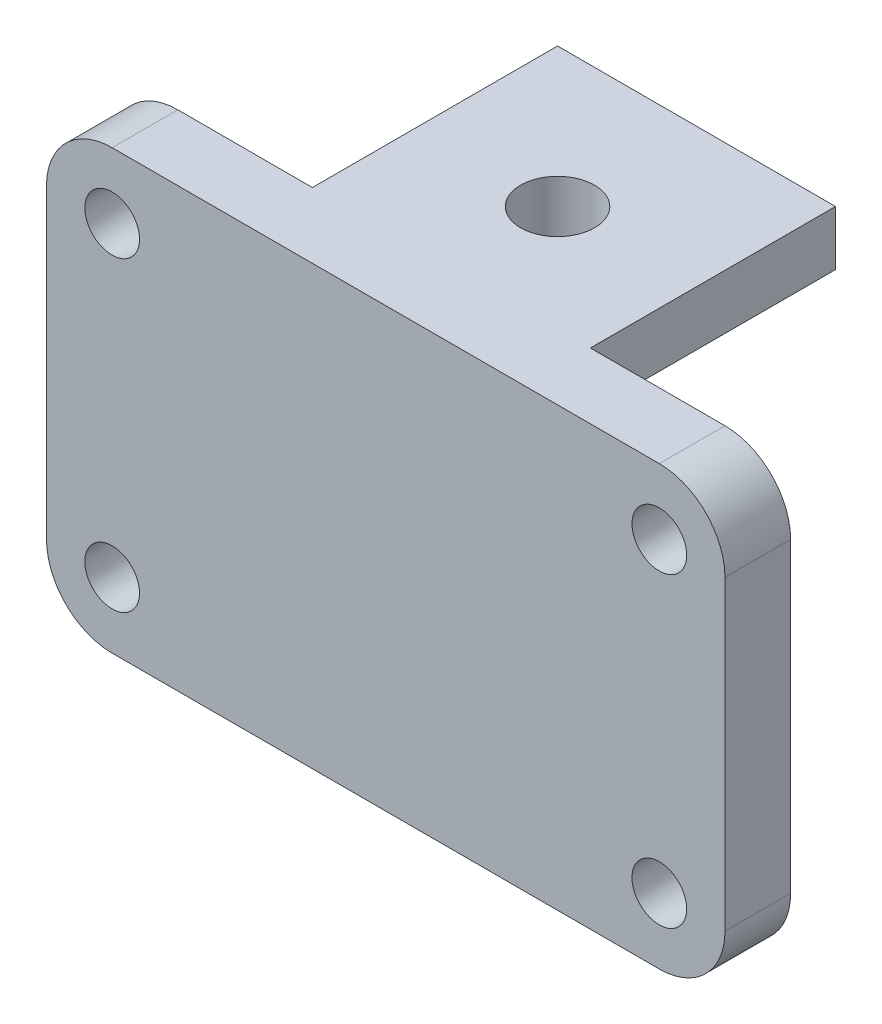
ISO-10303-21;
HEADER;
FILE_DESCRIPTION(('STEP AP214'),'2;1');
FILE_NAME('part.step','',(''),(''),'','','');
FILE_SCHEMA(('AUTOMOTIVE_DESIGN { 1 0 10303 214 1 1 1 1 }'));
ENDSEC;
DATA;
#1=APPLICATION_CONTEXT('core data for automotive mechanical design processes');
#2=APPLICATION_PROTOCOL_DEFINITION('international standard','automotive_design',2000,#1);
#3=PRODUCT_CONTEXT('',#1,'mechanical');
#4=PRODUCT('Part','Part','',(#3));
#5=PRODUCT_RELATED_PRODUCT_CATEGORY('part','',(#4));
#6=PRODUCT_DEFINITION_FORMATION('','',#4);
#7=PRODUCT_DEFINITION_CONTEXT('part definition',#1,'design');
#8=PRODUCT_DEFINITION('design','',#6,#7);
#9=PRODUCT_DEFINITION_SHAPE('','',#8);
#10=(LENGTH_UNIT() NAMED_UNIT(*) SI_UNIT(.MILLI.,.METRE.));
#11=(NAMED_UNIT(*) PLANE_ANGLE_UNIT() SI_UNIT($,.RADIAN.));
#12=(NAMED_UNIT(*) SI_UNIT($,.STERADIAN.) SOLID_ANGLE_UNIT());
#13=UNCERTAINTY_MEASURE_WITH_UNIT(LENGTH_MEASURE(1.E-05),#10,'distance_accuracy_value','');
#14=(GEOMETRIC_REPRESENTATION_CONTEXT(3) GLOBAL_UNCERTAINTY_ASSIGNED_CONTEXT((#13)) GLOBAL_UNIT_ASSIGNED_CONTEXT((#10,
#11,#12)) REPRESENTATION_CONTEXT('',''));
#15=CARTESIAN_POINT('',(0.,0.,0.));
#16=DIRECTION('',(0.,0.,1.));
#17=DIRECTION('',(1.,0.,0.));
#18=AXIS2_PLACEMENT_3D('',#15,#16,#17);
#19=CARTESIAN_POINT('',(12.7,5.,-12.7));
#20=DIRECTION('',(-1.,0.,0.));
#21=DIRECTION('',(0.,0.,1.));
#22=AXIS2_PLACEMENT_3D('',#19,#20,#21);
#23=PLANE('',#22);
#24=DIRECTION('',(0.,1.,0.));
#25=VECTOR('',#24,1.);
#26=CARTESIAN_POINT('',(12.7,5.,9.7));
#27=LINE('',#26,#25);
#28=CARTESIAN_POINT('',(12.7,0.,9.7));
#29=VERTEX_POINT('',#28);
#30=CARTESIAN_POINT('',(12.7,5.,9.7));
#31=VERTEX_POINT('',#30);
#32=EDGE_CURVE('E152',#29,#31,#27,.T.);
#33=ORIENTED_EDGE('',*,*,#32,.F.);
#34=DIRECTION('',(0.,0.,-1.));
#35=VECTOR('',#34,1.);
#36=CARTESIAN_POINT('',(12.7,0.,-12.7));
#37=LINE('',#36,#35);
#38=CARTESIAN_POINT('',(12.7,0.,-12.7));
#39=VERTEX_POINT('',#38);
#40=EDGE_CURVE('E137',#29,#39,#37,.T.);
#41=ORIENTED_EDGE('',*,*,#40,.T.);
#42=DIRECTION('',(0.,-1.,0.));
#43=VECTOR('',#42,1.);
#44=CARTESIAN_POINT('',(12.7,5.,-12.7));
#45=LINE('',#44,#43);
#46=CARTESIAN_POINT('',(12.7,5.,-12.7));
#47=VERTEX_POINT('',#46);
#48=EDGE_CURVE('E166',#47,#39,#45,.T.);
#49=ORIENTED_EDGE('',*,*,#48,.F.);
#50=DIRECTION('',(0.,0.,-1.));
#51=VECTOR('',#50,1.);
#52=CARTESIAN_POINT('',(12.7,5.,-12.7));
#53=LINE('',#52,#51);
#54=EDGE_CURVE('E153',#31,#47,#53,.T.);
#55=ORIENTED_EDGE('',*,*,#54,.F.);
#56=EDGE_LOOP('',(#33,#41,#49,#55));
#57=FACE_BOUND('',#56,.T.);
#58=ADVANCED_FACE('F47',(#57),#23,.F.);
#59=CARTESIAN_POINT('',(-12.7,5.,-12.7));
#60=DIRECTION('',(1.,0.,0.));
#61=DIRECTION('',(0.,0.,-1.));
#62=AXIS2_PLACEMENT_3D('',#59,#60,#61);
#63=PLANE('',#62);
#64=DIRECTION('',(0.,-1.,0.));
#65=VECTOR('',#64,1.);
#66=CARTESIAN_POINT('',(-12.7,5.,9.7));
#67=LINE('',#66,#65);
#68=CARTESIAN_POINT('',(-12.7,5.,9.7));
#69=VERTEX_POINT('',#68);
#70=CARTESIAN_POINT('',(-12.7,0.,9.7));
#71=VERTEX_POINT('',#70);
#72=EDGE_CURVE('E158',#69,#71,#67,.T.);
#73=ORIENTED_EDGE('',*,*,#72,.F.);
#74=DIRECTION('',(0.,0.,1.));
#75=VECTOR('',#74,1.);
#76=CARTESIAN_POINT('',(-12.7,5.,-12.7));
#77=LINE('',#76,#75);
#78=CARTESIAN_POINT('',(-12.7,5.,-12.7));
#79=VERTEX_POINT('',#78);
#80=EDGE_CURVE('E279',#79,#69,#77,.T.);
#81=ORIENTED_EDGE('',*,*,#80,.F.);
#82=DIRECTION('',(0.,-1.,0.));
#83=VECTOR('',#82,1.);
#84=CARTESIAN_POINT('',(-12.7,5.,-12.7));
#85=LINE('',#84,#83);
#86=CARTESIAN_POINT('',(-12.7,0.,-12.7));
#87=VERTEX_POINT('',#86);
#88=EDGE_CURVE('E172',#79,#87,#85,.T.);
#89=ORIENTED_EDGE('',*,*,#88,.T.);
#90=DIRECTION('',(0.,0.,1.));
#91=VECTOR('',#90,1.);
#92=CARTESIAN_POINT('',(-12.7,0.,-12.7));
#93=LINE('',#92,#91);
#94=EDGE_CURVE('E276',#87,#71,#93,.T.);
#95=ORIENTED_EDGE('',*,*,#94,.T.);
#96=EDGE_LOOP('',(#73,#81,#89,#95));
#97=FACE_BOUND('',#96,.T.);
#98=ADVANCED_FACE('F290',(#97),#63,.F.);
#99=CARTESIAN_POINT('',(0.,0.,0.));
#100=DIRECTION('',(0.,1.,0.));
#101=DIRECTION('',(0.,0.,1.));
#102=AXIS2_PLACEMENT_3D('',#99,#100,#101);
#103=PLANE('',#102);
#104=CARTESIAN_POINT('',(0.,0.,0.));
#105=DIRECTION('',(0.,1.,0.));
#106=DIRECTION('',(0.,0.,1.));
#107=AXIS2_PLACEMENT_3D('',#104,#105,#106);
#108=CIRCLE('',#107,3.37819999999999);
#109=CARTESIAN_POINT('',(0.,0.,3.37819999999999));
#110=VERTEX_POINT('',#109);
#111=EDGE_CURVE('E149',#110,#110,#108,.T.);
#112=ORIENTED_EDGE('',*,*,#111,.T.);
#113=EDGE_LOOP('',(#112));
#114=FACE_BOUND('',#113,.T.);
#115=DIRECTION('',(1.,0.,0.));
#116=VECTOR('',#115,1.);
#117=CARTESIAN_POINT('',(0.,0.,9.7));
#118=LINE('',#117,#116);
#119=EDGE_CURVE('E142',#71,#29,#118,.T.);
#120=ORIENTED_EDGE('',*,*,#119,.F.);
#121=ORIENTED_EDGE('',*,*,#94,.F.);
#122=DIRECTION('',(-1.,0.,0.));
#123=VECTOR('',#122,1.);
#124=CARTESIAN_POINT('',(-12.7,0.,-12.7));
#125=LINE('',#124,#123);
#126=EDGE_CURVE('E144',#39,#87,#125,.T.);
#127=ORIENTED_EDGE('',*,*,#126,.F.);
#128=ORIENTED_EDGE('',*,*,#40,.F.);
#129=EDGE_LOOP('',(#120,#121,#127,#128));
#130=FACE_BOUND('',#129,.T.);
#131=ADVANCED_FACE('F139',(#114,#130),#103,.F.);
#132=CARTESIAN_POINT('',(-12.7,5.,-12.7));
#133=DIRECTION('',(0.,0.,1.));
#134=DIRECTION('',(1.,0.,0.));
#135=AXIS2_PLACEMENT_3D('',#132,#133,#134);
#136=PLANE('',#135);
#137=ORIENTED_EDGE('',*,*,#126,.T.);
#138=ORIENTED_EDGE('',*,*,#88,.F.);
#139=DIRECTION('',(-1.,0.,0.));
#140=VECTOR('',#139,1.);
#141=CARTESIAN_POINT('',(-12.7,5.,-12.7));
#142=LINE('',#141,#140);
#143=EDGE_CURVE('E275',#47,#79,#142,.T.);
#144=ORIENTED_EDGE('',*,*,#143,.F.);
#145=ORIENTED_EDGE('',*,*,#48,.T.);
#146=EDGE_LOOP('',(#137,#138,#144,#145));
#147=FACE_BOUND('',#146,.T.);
#148=ADVANCED_FACE('F293',(#147),#136,.F.);
#149=CARTESIAN_POINT('',(0.,5.,0.));
#150=DIRECTION('',(0.,1.,0.));
#151=DIRECTION('',(0.,0.,1.));
#152=AXIS2_PLACEMENT_3D('',#149,#150,#151);
#153=PLANE('',#152);
#154=DIRECTION('',(1.,0.,0.));
#155=VECTOR('',#154,1.);
#156=CARTESIAN_POINT('',(0.,5.,15.7));
#157=LINE('',#156,#155);
#158=CARTESIAN_POINT('',(-25.,5.,15.7));
#159=VERTEX_POINT('',#158);
#160=CARTESIAN_POINT('',(25.,5.,15.7));
#161=VERTEX_POINT('',#160);
#162=EDGE_CURVE('E222',#159,#161,#157,.T.);
#163=ORIENTED_EDGE('',*,*,#162,.T.);
#164=DIRECTION('',(0.,0.,1.));
#165=VECTOR('',#164,1.);
#166=CARTESIAN_POINT('',(25.,5.,0.));
#167=LINE('',#166,#165);
#168=CARTESIAN_POINT('',(25.,5.,9.7));
#169=VERTEX_POINT('',#168);
#170=EDGE_CURVE('E11',#161,#169,#167,.F.);
#171=ORIENTED_EDGE('',*,*,#170,.T.);
#172=DIRECTION('',(1.,0.,0.));
#173=VECTOR('',#172,1.);
#174=CARTESIAN_POINT('',(0.,5.,9.7));
#175=LINE('',#174,#173);
#176=EDGE_CURVE('E264',#31,#169,#175,.T.);
#177=ORIENTED_EDGE('',*,*,#176,.F.);
#178=ORIENTED_EDGE('',*,*,#54,.T.);
#179=ORIENTED_EDGE('',*,*,#143,.T.);
#180=ORIENTED_EDGE('',*,*,#80,.T.);
#181=CARTESIAN_POINT('',(-25.,5.,9.7));
#182=VERTEX_POINT('',#181);
#183=EDGE_CURVE('E225',#182,#69,#175,.T.);
#184=ORIENTED_EDGE('',*,*,#183,.F.);
#185=DIRECTION('',(0.,0.,1.));
#186=VECTOR('',#185,1.);
#187=CARTESIAN_POINT('',(-25.,5.,15.7));
#188=LINE('',#187,#186);
#189=EDGE_CURVE('E56',#182,#159,#188,.T.);
#190=ORIENTED_EDGE('',*,*,#189,.T.);
#191=EDGE_LOOP('',(#163,#171,#177,#178,#179,#180,#184,#190));
#192=FACE_BOUND('',#191,.T.);
#193=CARTESIAN_POINT('',(0.,5.,0.));
#194=DIRECTION('',(0.,1.,0.));
#195=DIRECTION('',(0.,0.,1.));
#196=AXIS2_PLACEMENT_3D('',#193,#194,#195);
#197=CIRCLE('',#196,3.37819999999999);
#198=CARTESIAN_POINT('',(0.,5.,3.37819999999999));
#199=VERTEX_POINT('',#198);
#200=EDGE_CURVE('E157',#199,#199,#197,.T.);
#201=ORIENTED_EDGE('',*,*,#200,.F.);
#202=EDGE_LOOP('',(#201));
#203=FACE_BOUND('',#202,.T.);
#204=ADVANCED_FACE('F220',(#192,#203),#153,.T.);
#205=CARTESIAN_POINT('',(0.,5.,0.));
#206=DIRECTION('',(0.,1.,0.));
#207=DIRECTION('',(0.,0.,1.));
#208=AXIS2_PLACEMENT_3D('',#205,#206,#207);
#209=CYLINDRICAL_SURFACE('',#208,3.37819999999999);
#210=ORIENTED_EDGE('',*,*,#111,.F.);
#211=EDGE_LOOP('',(#210));
#212=FACE_BOUND('',#211,.T.);
#213=ORIENTED_EDGE('',*,*,#200,.T.);
#214=EDGE_LOOP('',(#213));
#215=FACE_BOUND('',#214,.T.);
#216=ADVANCED_FACE('F388',(#212,#215),#209,.F.);
#217=CARTESIAN_POINT('',(0.,0.,9.7));
#218=DIRECTION('',(0.,0.,1.));
#219=DIRECTION('',(1.,0.,0.));
#220=AXIS2_PLACEMENT_3D('',#217,#218,#219);
#221=PLANE('',#220);
#222=CARTESIAN_POINT('',(-25.,-29.,9.7));
#223=DIRECTION('',(0.,0.,1.));
#224=DIRECTION('',(1.,0.,0.));
#225=AXIS2_PLACEMENT_3D('',#222,#223,#224);
#226=CIRCLE('',#225,2.5);
#227=CARTESIAN_POINT('',(-22.5,-29.,9.7));
#228=VERTEX_POINT('',#227);
#229=EDGE_CURVE('E310',#228,#228,#226,.T.);
#230=ORIENTED_EDGE('',*,*,#229,.T.);
#231=EDGE_LOOP('',(#230));
#232=FACE_BOUND('',#231,.T.);
#233=CARTESIAN_POINT('',(25.,-29.,9.7));
#234=DIRECTION('',(0.,0.,1.));
#235=DIRECTION('',(1.,0.,0.));
#236=AXIS2_PLACEMENT_3D('',#233,#234,#235);
#237=CIRCLE('',#236,2.5);
#238=CARTESIAN_POINT('',(27.5,-29.,9.7));
#239=VERTEX_POINT('',#238);
#240=EDGE_CURVE('E314',#239,#239,#237,.T.);
#241=ORIENTED_EDGE('',*,*,#240,.T.);
#242=EDGE_LOOP('',(#241));
#243=FACE_BOUND('',#242,.T.);
#244=CARTESIAN_POINT('',(25.,-1.,9.7));
#245=DIRECTION('',(0.,0.,1.));
#246=DIRECTION('',(1.,0.,0.));
#247=AXIS2_PLACEMENT_3D('',#244,#245,#246);
#248=CIRCLE('',#247,2.5);
#249=CARTESIAN_POINT('',(27.5,-1.,9.7));
#250=VERTEX_POINT('',#249);
#251=EDGE_CURVE('E317',#250,#250,#248,.T.);
#252=ORIENTED_EDGE('',*,*,#251,.T.);
#253=EDGE_LOOP('',(#252));
#254=FACE_BOUND('',#253,.T.);
#255=CARTESIAN_POINT('',(-25.,-1.,9.7));
#256=DIRECTION('',(0.,0.,1.));
#257=DIRECTION('',(1.,0.,0.));
#258=AXIS2_PLACEMENT_3D('',#255,#256,#257);
#259=CIRCLE('',#258,2.5);
#260=CARTESIAN_POINT('',(-22.5,-1.,9.7));
#261=VERTEX_POINT('',#260);
#262=EDGE_CURVE('E240',#261,#261,#259,.T.);
#263=ORIENTED_EDGE('',*,*,#262,.T.);
#264=EDGE_LOOP('',(#263));
#265=FACE_BOUND('',#264,.T.);
#266=DIRECTION('',(0.,1.,0.));
#267=VECTOR('',#266,1.);
#268=CARTESIAN_POINT('',(31.,0.,9.7));
#269=LINE('',#268,#267);
#270=CARTESIAN_POINT('',(31.,-29.,9.7));
#271=VERTEX_POINT('',#270);
#272=CARTESIAN_POINT('',(31.,-1.,9.7));
#273=VERTEX_POINT('',#272);
#274=EDGE_CURVE('E306',#271,#273,#269,.T.);
#275=ORIENTED_EDGE('',*,*,#274,.F.);
#276=CARTESIAN_POINT('',(25.,-29.,9.7));
#277=DIRECTION('',(0.,0.,1.));
#278=DIRECTION('',(1.,0.,0.));
#279=AXIS2_PLACEMENT_3D('',#276,#277,#278);
#280=CIRCLE('',#279,6.);
#281=CARTESIAN_POINT('',(25.,-35.,9.7));
#282=VERTEX_POINT('',#281);
#283=EDGE_CURVE('E206',#271,#282,#280,.F.);
#284=ORIENTED_EDGE('',*,*,#283,.T.);
#285=DIRECTION('',(1.,0.,0.));
#286=VECTOR('',#285,1.);
#287=CARTESIAN_POINT('',(0.,-35.,9.7));
#288=LINE('',#287,#286);
#289=CARTESIAN_POINT('',(-25.,-35.,9.7));
#290=VERTEX_POINT('',#289);
#291=EDGE_CURVE('E302',#290,#282,#288,.T.);
#292=ORIENTED_EDGE('',*,*,#291,.F.);
#293=CARTESIAN_POINT('',(-25.,-29.,9.7));
#294=DIRECTION('',(0.,0.,1.));
#295=DIRECTION('',(1.,0.,0.));
#296=AXIS2_PLACEMENT_3D('',#293,#294,#295);
#297=CIRCLE('',#296,6.);
#298=CARTESIAN_POINT('',(-31.,-29.,9.7));
#299=VERTEX_POINT('',#298);
#300=EDGE_CURVE('E203',#290,#299,#297,.F.);
#301=ORIENTED_EDGE('',*,*,#300,.T.);
#302=DIRECTION('',(0.,1.,0.));
#303=VECTOR('',#302,1.);
#304=CARTESIAN_POINT('',(-31.,0.,9.7));
#305=LINE('',#304,#303);
#306=CARTESIAN_POINT('',(-31.,-1.,9.7));
#307=VERTEX_POINT('',#306);
#308=EDGE_CURVE('E298',#299,#307,#305,.T.);
#309=ORIENTED_EDGE('',*,*,#308,.T.);
#310=CARTESIAN_POINT('',(-25.,-1.,9.7));
#311=DIRECTION('',(0.,0.,1.));
#312=DIRECTION('',(1.,0.,0.));
#313=AXIS2_PLACEMENT_3D('',#310,#311,#312);
#314=CIRCLE('',#313,6.);
#315=EDGE_CURVE('E63',#307,#182,#314,.F.);
#316=ORIENTED_EDGE('',*,*,#315,.T.);
#317=ORIENTED_EDGE('',*,*,#183,.T.);
#318=ORIENTED_EDGE('',*,*,#72,.T.);
#319=ORIENTED_EDGE('',*,*,#119,.T.);
#320=ORIENTED_EDGE('',*,*,#32,.T.);
#321=ORIENTED_EDGE('',*,*,#176,.T.);
#322=CARTESIAN_POINT('',(25.,-1.,9.7));
#323=DIRECTION('',(0.,0.,1.));
#324=DIRECTION('',(1.,0.,0.));
#325=AXIS2_PLACEMENT_3D('',#322,#323,#324);
#326=CIRCLE('',#325,6.);
#327=EDGE_CURVE('E200',#169,#273,#326,.F.);
#328=ORIENTED_EDGE('',*,*,#327,.T.);
#329=EDGE_LOOP('',(#275,#284,#292,#301,#309,#316,#317,#318,#319,#320,#321,#328));
#330=FACE_BOUND('',#329,.T.);
#331=ADVANCED_FACE('F162',(#232,#243,#254,#265,#330),#221,.F.);
#332=CARTESIAN_POINT('',(31.,0.,9.7));
#333=DIRECTION('',(1.,0.,0.));
#334=DIRECTION('',(0.,0.,-1.));
#335=AXIS2_PLACEMENT_3D('',#332,#333,#334);
#336=PLANE('',#335);
#337=DIRECTION('',(0.,1.,0.));
#338=VECTOR('',#337,1.);
#339=CARTESIAN_POINT('',(31.,0.,15.7));
#340=LINE('',#339,#338);
#341=CARTESIAN_POINT('',(31.,-29.,15.7));
#342=VERTEX_POINT('',#341);
#343=CARTESIAN_POINT('',(31.,-1.,15.7));
#344=VERTEX_POINT('',#343);
#345=EDGE_CURVE('E245',#342,#344,#340,.T.);
#346=ORIENTED_EDGE('',*,*,#345,.F.);
#347=DIRECTION('',(0.,0.,1.));
#348=VECTOR('',#347,1.);
#349=CARTESIAN_POINT('',(31.,-29.,9.7));
#350=LINE('',#349,#348);
#351=EDGE_CURVE('E195',#342,#271,#350,.F.);
#352=ORIENTED_EDGE('',*,*,#351,.T.);
#353=ORIENTED_EDGE('',*,*,#274,.T.);
#354=DIRECTION('',(0.,0.,1.));
#355=VECTOR('',#354,1.);
#356=CARTESIAN_POINT('',(31.,-1.,9.7));
#357=LINE('',#356,#355);
#358=EDGE_CURVE('E191',#273,#344,#357,.T.);
#359=ORIENTED_EDGE('',*,*,#358,.T.);
#360=EDGE_LOOP('',(#346,#352,#353,#359));
#361=FACE_BOUND('',#360,.T.);
#362=ADVANCED_FACE('F366',(#361),#336,.T.);
#363=CARTESIAN_POINT('',(0.,-35.,9.7));
#364=DIRECTION('',(0.,-1.,0.));
#365=DIRECTION('',(0.,0.,-1.));
#366=AXIS2_PLACEMENT_3D('',#363,#364,#365);
#367=PLANE('',#366);
#368=ORIENTED_EDGE('',*,*,#291,.T.);
#369=DIRECTION('',(0.,0.,1.));
#370=VECTOR('',#369,1.);
#371=CARTESIAN_POINT('',(25.,-35.,9.7));
#372=LINE('',#371,#370);
#373=CARTESIAN_POINT('',(25.,-35.,15.7));
#374=VERTEX_POINT('',#373);
#375=EDGE_CURVE('E170',#282,#374,#372,.T.);
#376=ORIENTED_EDGE('',*,*,#375,.T.);
#377=DIRECTION('',(1.,0.,0.));
#378=VECTOR('',#377,1.);
#379=CARTESIAN_POINT('',(0.,-35.,15.7));
#380=LINE('',#379,#378);
#381=CARTESIAN_POINT('',(-25.,-35.,15.7));
#382=VERTEX_POINT('',#381);
#383=EDGE_CURVE('E237',#382,#374,#380,.T.);
#384=ORIENTED_EDGE('',*,*,#383,.F.);
#385=DIRECTION('',(0.,0.,1.));
#386=VECTOR('',#385,1.);
#387=CARTESIAN_POINT('',(-25.,-35.,9.7));
#388=LINE('',#387,#386);
#389=EDGE_CURVE('E165',#382,#290,#388,.F.);
#390=ORIENTED_EDGE('',*,*,#389,.T.);
#391=EDGE_LOOP('',(#368,#376,#384,#390));
#392=FACE_BOUND('',#391,.T.);
#393=ADVANCED_FACE('F372',(#392),#367,.T.);
#394=CARTESIAN_POINT('',(25.,-1.,9.7));
#395=DIRECTION('',(0.,0.,1.));
#396=DIRECTION('',(1.,0.,0.));
#397=AXIS2_PLACEMENT_3D('',#394,#395,#396);
#398=CYLINDRICAL_SURFACE('',#397,2.5);
#399=ORIENTED_EDGE('',*,*,#251,.F.);
#400=EDGE_LOOP('',(#399));
#401=FACE_BOUND('',#400,.T.);
#402=CARTESIAN_POINT('',(25.,-1.,15.7));
#403=DIRECTION('',(0.,0.,1.));
#404=DIRECTION('',(1.,0.,0.));
#405=AXIS2_PLACEMENT_3D('',#402,#403,#404);
#406=CIRCLE('',#405,2.5);
#407=CARTESIAN_POINT('',(27.5,-1.,15.7));
#408=VERTEX_POINT('',#407);
#409=EDGE_CURVE('E256',#408,#408,#406,.T.);
#410=ORIENTED_EDGE('',*,*,#409,.T.);
#411=EDGE_LOOP('',(#410));
#412=FACE_BOUND('',#411,.T.);
#413=ADVANCED_FACE('F460',(#401,#412),#398,.F.);
#414=CARTESIAN_POINT('',(25.,-29.,9.7));
#415=DIRECTION('',(0.,0.,1.));
#416=DIRECTION('',(1.,0.,0.));
#417=AXIS2_PLACEMENT_3D('',#414,#415,#416);
#418=CYLINDRICAL_SURFACE('',#417,2.5);
#419=ORIENTED_EDGE('',*,*,#240,.F.);
#420=EDGE_LOOP('',(#419));
#421=FACE_BOUND('',#420,.T.);
#422=CARTESIAN_POINT('',(25.,-29.,15.7));
#423=DIRECTION('',(0.,0.,1.));
#424=DIRECTION('',(1.,0.,0.));
#425=AXIS2_PLACEMENT_3D('',#422,#423,#424);
#426=CIRCLE('',#425,2.5);
#427=CARTESIAN_POINT('',(27.5,-29.,15.7));
#428=VERTEX_POINT('',#427);
#429=EDGE_CURVE('E252',#428,#428,#426,.T.);
#430=ORIENTED_EDGE('',*,*,#429,.T.);
#431=EDGE_LOOP('',(#430));
#432=FACE_BOUND('',#431,.T.);
#433=ADVANCED_FACE('F382',(#421,#432),#418,.F.);
#434=CARTESIAN_POINT('',(-25.,-29.,9.7));
#435=DIRECTION('',(0.,0.,1.));
#436=DIRECTION('',(1.,0.,0.));
#437=AXIS2_PLACEMENT_3D('',#434,#435,#436);
#438=CYLINDRICAL_SURFACE('',#437,2.5);
#439=ORIENTED_EDGE('',*,*,#229,.F.);
#440=EDGE_LOOP('',(#439));
#441=FACE_BOUND('',#440,.T.);
#442=CARTESIAN_POINT('',(-25.,-29.,15.7));
#443=DIRECTION('',(0.,0.,1.));
#444=DIRECTION('',(1.,0.,0.));
#445=AXIS2_PLACEMENT_3D('',#442,#443,#444);
#446=CIRCLE('',#445,2.5);
#447=CARTESIAN_POINT('',(-22.5,-29.,15.7));
#448=VERTEX_POINT('',#447);
#449=EDGE_CURVE('E248',#448,#448,#446,.T.);
#450=ORIENTED_EDGE('',*,*,#449,.T.);
#451=EDGE_LOOP('',(#450));
#452=FACE_BOUND('',#451,.T.);
#453=ADVANCED_FACE('F376',(#441,#452),#438,.F.);
#454=CARTESIAN_POINT('',(-31.,0.,9.7));
#455=DIRECTION('',(1.,0.,0.));
#456=DIRECTION('',(0.,0.,-1.));
#457=AXIS2_PLACEMENT_3D('',#454,#455,#456);
#458=PLANE('',#457);
#459=ORIENTED_EDGE('',*,*,#308,.F.);
#460=DIRECTION('',(0.,0.,1.));
#461=VECTOR('',#460,1.);
#462=CARTESIAN_POINT('',(-31.,-29.,15.7));
#463=LINE('',#462,#461);
#464=CARTESIAN_POINT('',(-31.,-29.,15.7));
#465=VERTEX_POINT('',#464);
#466=EDGE_CURVE('E211',#299,#465,#463,.T.);
#467=ORIENTED_EDGE('',*,*,#466,.T.);
#468=DIRECTION('',(0.,1.,0.));
#469=VECTOR('',#468,1.);
#470=CARTESIAN_POINT('',(-31.,0.,15.7));
#471=LINE('',#470,#469);
#472=CARTESIAN_POINT('',(-31.,-1.,15.7));
#473=VERTEX_POINT('',#472);
#474=EDGE_CURVE('E234',#465,#473,#471,.T.);
#475=ORIENTED_EDGE('',*,*,#474,.T.);
#476=DIRECTION('',(0.,0.,1.));
#477=VECTOR('',#476,1.);
#478=CARTESIAN_POINT('',(-31.,-1.,9.7));
#479=LINE('',#478,#477);
#480=EDGE_CURVE('E71',#473,#307,#479,.F.);
#481=ORIENTED_EDGE('',*,*,#480,.T.);
#482=EDGE_LOOP('',(#459,#467,#475,#481));
#483=FACE_BOUND('',#482,.T.);
#484=ADVANCED_FACE('F330',(#483),#458,.F.);
#485=CARTESIAN_POINT('',(-25.,-1.,9.7));
#486=DIRECTION('',(0.,0.,1.));
#487=DIRECTION('',(1.,0.,0.));
#488=AXIS2_PLACEMENT_3D('',#485,#486,#487);
#489=CYLINDRICAL_SURFACE('',#488,2.5);
#490=ORIENTED_EDGE('',*,*,#262,.F.);
#491=EDGE_LOOP('',(#490));
#492=FACE_BOUND('',#491,.T.);
#493=CARTESIAN_POINT('',(-25.,-1.,15.7));
#494=DIRECTION('',(0.,0.,1.));
#495=DIRECTION('',(1.,0.,0.));
#496=AXIS2_PLACEMENT_3D('',#493,#494,#495);
#497=CIRCLE('',#496,2.5);
#498=CARTESIAN_POINT('',(-22.5,-1.,15.7));
#499=VERTEX_POINT('',#498);
#500=EDGE_CURVE('E260',#499,#499,#497,.T.);
#501=ORIENTED_EDGE('',*,*,#500,.T.);
#502=EDGE_LOOP('',(#501));
#503=FACE_BOUND('',#502,.T.);
#504=ADVANCED_FACE('F327',(#492,#503),#489,.F.);
#505=CARTESIAN_POINT('',(0.,0.,15.7));
#506=DIRECTION('',(0.,0.,1.));
#507=DIRECTION('',(1.,0.,0.));
#508=AXIS2_PLACEMENT_3D('',#505,#506,#507);
#509=PLANE('',#508);
#510=ORIENTED_EDGE('',*,*,#383,.T.);
#511=CARTESIAN_POINT('',(25.,-29.,15.7));
#512=DIRECTION('',(0.,0.,1.));
#513=DIRECTION('',(1.,0.,0.));
#514=AXIS2_PLACEMENT_3D('',#511,#512,#513);
#515=CIRCLE('',#514,6.);
#516=EDGE_CURVE('E188',#374,#342,#515,.T.);
#517=ORIENTED_EDGE('',*,*,#516,.T.);
#518=ORIENTED_EDGE('',*,*,#345,.T.);
#519=CARTESIAN_POINT('',(25.,-1.,15.7));
#520=DIRECTION('',(0.,0.,1.));
#521=DIRECTION('',(1.,0.,0.));
#522=AXIS2_PLACEMENT_3D('',#519,#520,#521);
#523=CIRCLE('',#522,6.);
#524=EDGE_CURVE('E182',#344,#161,#523,.T.);
#525=ORIENTED_EDGE('',*,*,#524,.T.);
#526=ORIENTED_EDGE('',*,*,#162,.F.);
#527=CARTESIAN_POINT('',(-25.,-1.,15.7));
#528=DIRECTION('',(0.,0.,1.));
#529=DIRECTION('',(1.,0.,0.));
#530=AXIS2_PLACEMENT_3D('',#527,#528,#529);
#531=CIRCLE('',#530,6.);
#532=EDGE_CURVE('E179',#159,#473,#531,.T.);
#533=ORIENTED_EDGE('',*,*,#532,.T.);
#534=ORIENTED_EDGE('',*,*,#474,.F.);
#535=CARTESIAN_POINT('',(-25.,-29.,15.7));
#536=DIRECTION('',(0.,0.,1.));
#537=DIRECTION('',(1.,0.,0.));
#538=AXIS2_PLACEMENT_3D('',#535,#536,#537);
#539=CIRCLE('',#538,6.);
#540=EDGE_CURVE('E185',#465,#382,#539,.T.);
#541=ORIENTED_EDGE('',*,*,#540,.T.);
#542=EDGE_LOOP('',(#510,#517,#518,#525,#526,#533,#534,#541));
#543=FACE_BOUND('',#542,.T.);
#544=ORIENTED_EDGE('',*,*,#449,.F.);
#545=EDGE_LOOP('',(#544));
#546=FACE_BOUND('',#545,.T.);
#547=ORIENTED_EDGE('',*,*,#429,.F.);
#548=EDGE_LOOP('',(#547));
#549=FACE_BOUND('',#548,.T.);
#550=ORIENTED_EDGE('',*,*,#409,.F.);
#551=EDGE_LOOP('',(#550));
#552=FACE_BOUND('',#551,.T.);
#553=ORIENTED_EDGE('',*,*,#500,.F.);
#554=EDGE_LOOP('',(#553));
#555=FACE_BOUND('',#554,.T.);
#556=ADVANCED_FACE('F229',(#543,#546,#549,#552,#555),#509,.T.);
#557=CARTESIAN_POINT('',(25.,-29.,9.7));
#558=DIRECTION('',(0.,0.,1.));
#559=DIRECTION('',(1.,0.,0.));
#560=AXIS2_PLACEMENT_3D('',#557,#558,#559);
#561=CYLINDRICAL_SURFACE('',#560,6.);
#562=ORIENTED_EDGE('',*,*,#283,.F.);
#563=ORIENTED_EDGE('',*,*,#351,.F.);
#564=ORIENTED_EDGE('',*,*,#516,.F.);
#565=ORIENTED_EDGE('',*,*,#375,.F.);
#566=EDGE_LOOP('',(#562,#563,#564,#565));
#567=FACE_BOUND('',#566,.T.);
#568=ADVANCED_FACE('F335',(#567),#561,.T.);
#569=CARTESIAN_POINT('',(-25.,-29.,9.7));
#570=DIRECTION('',(0.,0.,-1.));
#571=DIRECTION('',(-1.,0.,0.));
#572=AXIS2_PLACEMENT_3D('',#569,#570,#571);
#573=CYLINDRICAL_SURFACE('',#572,6.);
#574=ORIENTED_EDGE('',*,*,#300,.F.);
#575=ORIENTED_EDGE('',*,*,#389,.F.);
#576=ORIENTED_EDGE('',*,*,#540,.F.);
#577=ORIENTED_EDGE('',*,*,#466,.F.);
#578=EDGE_LOOP('',(#574,#575,#576,#577));
#579=FACE_BOUND('',#578,.T.);
#580=ADVANCED_FACE('F341',(#579),#573,.T.);
#581=CARTESIAN_POINT('',(25.,-1.,9.7));
#582=DIRECTION('',(0.,0.,1.));
#583=DIRECTION('',(1.,0.,0.));
#584=AXIS2_PLACEMENT_3D('',#581,#582,#583);
#585=CYLINDRICAL_SURFACE('',#584,6.);
#586=ORIENTED_EDGE('',*,*,#327,.F.);
#587=ORIENTED_EDGE('',*,*,#170,.F.);
#588=ORIENTED_EDGE('',*,*,#524,.F.);
#589=ORIENTED_EDGE('',*,*,#358,.F.);
#590=EDGE_LOOP('',(#586,#587,#588,#589));
#591=FACE_BOUND('',#590,.T.);
#592=ADVANCED_FACE('F355',(#591),#585,.T.);
#593=CARTESIAN_POINT('',(-25.,-1.,0.));
#594=DIRECTION('',(0.,0.,-1.));
#595=DIRECTION('',(-1.,0.,0.));
#596=AXIS2_PLACEMENT_3D('',#593,#594,#595);
#597=CYLINDRICAL_SURFACE('',#596,6.);
#598=ORIENTED_EDGE('',*,*,#315,.F.);
#599=ORIENTED_EDGE('',*,*,#480,.F.);
#600=ORIENTED_EDGE('',*,*,#532,.F.);
#601=ORIENTED_EDGE('',*,*,#189,.F.);
#602=EDGE_LOOP('',(#598,#599,#600,#601));
#603=FACE_BOUND('',#602,.T.);
#604=ADVANCED_FACE('F49',(#603),#597,.T.);
#605=CLOSED_SHELL('',(#58,#98,#131,#148,#204,#216,#331,#362,#393,#413,#433,#453,#484,#504,#556,
#568,#580,#592,#604));
#606=MANIFOLD_SOLID_BREP('B2',#605);
#607=ADVANCED_BREP_SHAPE_REPRESENTATION('',(#18,#606),#14);
#608=SHAPE_DEFINITION_REPRESENTATION(#9,#607);
ENDSEC;
END-ISO-10303-21;
